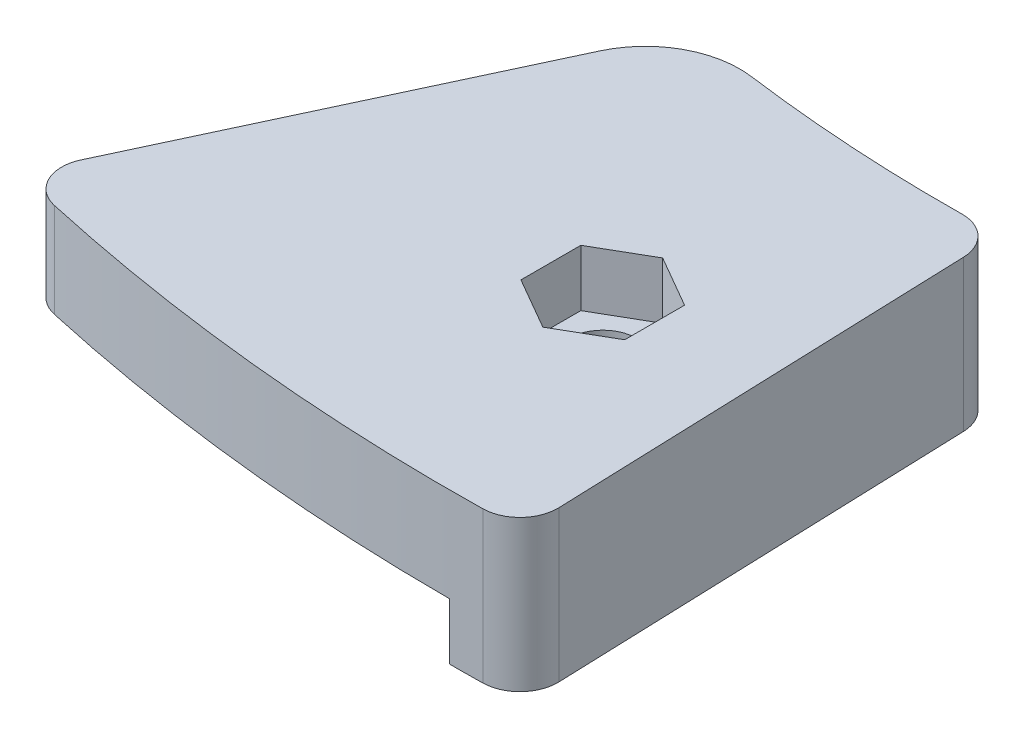
ISO-10303-21;
HEADER;
FILE_DESCRIPTION(('STEP AP214'),'2;1');
FILE_NAME('part.step','',(''),(''),'','','');
FILE_SCHEMA(('AUTOMOTIVE_DESIGN { 1 0 10303 214 1 1 1 1 }'));
ENDSEC;
DATA;
#1=APPLICATION_CONTEXT('core data for automotive mechanical design processes');
#2=APPLICATION_PROTOCOL_DEFINITION('international standard','automotive_design',2000,#1);
#3=PRODUCT_CONTEXT('',#1,'mechanical');
#4=PRODUCT('Part','Part','',(#3));
#5=PRODUCT_RELATED_PRODUCT_CATEGORY('part','',(#4));
#6=PRODUCT_DEFINITION_FORMATION('','',#4);
#7=PRODUCT_DEFINITION_CONTEXT('part definition',#1,'design');
#8=PRODUCT_DEFINITION('design','',#6,#7);
#9=PRODUCT_DEFINITION_SHAPE('','',#8);
#10=(LENGTH_UNIT() NAMED_UNIT(*) SI_UNIT(.MILLI.,.METRE.));
#11=(NAMED_UNIT(*) PLANE_ANGLE_UNIT() SI_UNIT($,.RADIAN.));
#12=(NAMED_UNIT(*) SI_UNIT($,.STERADIAN.) SOLID_ANGLE_UNIT());
#13=UNCERTAINTY_MEASURE_WITH_UNIT(LENGTH_MEASURE(1.E-05),#10,'distance_accuracy_value','');
#14=(GEOMETRIC_REPRESENTATION_CONTEXT(3) GLOBAL_UNCERTAINTY_ASSIGNED_CONTEXT((#13)) GLOBAL_UNIT_ASSIGNED_CONTEXT((#10,
#11,#12)) REPRESENTATION_CONTEXT('',''));
#15=CARTESIAN_POINT('',(0.,0.,0.));
#16=DIRECTION('',(0.,0.,1.));
#17=DIRECTION('',(1.,0.,0.));
#18=AXIS2_PLACEMENT_3D('',#15,#16,#17);
#19=CARTESIAN_POINT('',(-5.,0.,95.38));
#20=DIRECTION('',(0.,1.,0.));
#21=DIRECTION('',(0.,0.,1.));
#22=AXIS2_PLACEMENT_3D('',#19,#20,#21);
#23=CYLINDRICAL_SURFACE('',#22,1.8);
#24=CARTESIAN_POINT('',(-5.,0.,95.38));
#25=DIRECTION('',(0.,1.,0.));
#26=DIRECTION('',(0.,0.,1.));
#27=AXIS2_PLACEMENT_3D('',#24,#25,#26);
#28=CIRCLE('',#27,1.8);
#29=CARTESIAN_POINT('',(-5.,0.,97.18));
#30=VERTEX_POINT('',#29);
#31=EDGE_CURVE('E234',#30,#30,#28,.T.);
#32=ORIENTED_EDGE('',*,*,#31,.F.);
#33=EDGE_LOOP('',(#32));
#34=FACE_BOUND('',#33,.T.);
#35=CARTESIAN_POINT('',(-5.,2.,95.38));
#36=DIRECTION('',(0.,1.,0.));
#37=DIRECTION('',(0.,0.,1.));
#38=AXIS2_PLACEMENT_3D('',#35,#36,#37);
#39=CIRCLE('',#38,1.8);
#40=CARTESIAN_POINT('',(-5.,2.,97.18));
#41=VERTEX_POINT('',#40);
#42=EDGE_CURVE('E212',#41,#41,#39,.F.);
#43=ORIENTED_EDGE('',*,*,#42,.F.);
#44=EDGE_LOOP('',(#43));
#45=FACE_BOUND('',#44,.T.);
#46=ADVANCED_FACE('F41',(#34,#45),#23,.F.);
#47=CARTESIAN_POINT('',(0.,5.,0.));
#48=DIRECTION('',(0.,-1.,0.));
#49=DIRECTION('',(0.,0.,-1.));
#50=AXIS2_PLACEMENT_3D('',#47,#48,#49);
#51=CYLINDRICAL_SURFACE('',#50,82.26);
#52=CARTESIAN_POINT('',(0.,5.,0.));
#53=DIRECTION('',(0.,-1.,0.));
#54=DIRECTION('',(0.,0.,1.));
#55=AXIS2_PLACEMENT_3D('',#52,#53,#54);
#56=CIRCLE('',#55,82.26);
#57=CARTESIAN_POINT('',(0.918685308190236,5.,82.2548698698412));
#58=VERTEX_POINT('',#57);
#59=CARTESIAN_POINT('',(-10.973391310481,5.,81.5247955112251));
#60=VERTEX_POINT('',#59);
#61=EDGE_CURVE('E238',#58,#60,#56,.T.);
#62=ORIENTED_EDGE('',*,*,#61,.F.);
#63=DIRECTION('',(0.,-1.,0.));
#64=VECTOR('',#63,1.);
#65=CARTESIAN_POINT('',(0.918685308190236,5.,82.2548698698412));
#66=LINE('',#65,#64);
#67=CARTESIAN_POINT('',(0.918685308190236,0.,82.2548698698412));
#68=VERTEX_POINT('',#67);
#69=EDGE_CURVE('E287',#58,#68,#66,.T.);
#70=ORIENTED_EDGE('',*,*,#69,.T.);
#71=CARTESIAN_POINT('',(0.,0.,0.));
#72=DIRECTION('',(0.,-1.,0.));
#73=DIRECTION('',(0.,0.,1.));
#74=AXIS2_PLACEMENT_3D('',#71,#72,#73);
#75=CIRCLE('',#74,82.26);
#76=CARTESIAN_POINT('',(-10.973391310481,0.,81.5247955112251));
#77=VERTEX_POINT('',#76);
#78=EDGE_CURVE('E240',#68,#77,#75,.T.);
#79=ORIENTED_EDGE('',*,*,#78,.T.);
#80=DIRECTION('',(0.,-1.,0.));
#81=VECTOR('',#80,1.);
#82=CARTESIAN_POINT('',(-10.973391310481,5.,81.5247955112251));
#83=LINE('',#82,#81);
#84=EDGE_CURVE('E264',#77,#60,#83,.F.);
#85=ORIENTED_EDGE('',*,*,#84,.T.);
#86=EDGE_LOOP('',(#62,#70,#79,#85));
#87=FACE_BOUND('',#86,.T.);
#88=ADVANCED_FACE('F343',(#87),#51,.F.);
#89=CARTESIAN_POINT('',(-14.5819211322851,5.,80.9572428884026));
#90=DIRECTION('',(0.90630778703665,0.,0.4226182617407));
#91=DIRECTION('',(0.4226182617407,0.,-0.90630778703665));
#92=AXIS2_PLACEMENT_3D('',#89,#90,#91);
#93=PLANE('',#92);
#94=DIRECTION('',(-0.4226182617407,0.,0.90630778703665));
#95=VECTOR('',#94,1.);
#96=CARTESIAN_POINT('',(-14.5819211322851,0.,80.9572428884026));
#97=LINE('',#96,#95);
#98=CARTESIAN_POINT('',(-16.171924611728,0.,84.3670163537023));
#99=VERTEX_POINT('',#98);
#100=CARTESIAN_POINT('',(-24.9159468699549,0.,103.118632599559));
#101=VERTEX_POINT('',#100);
#102=EDGE_CURVE('E249',#99,#101,#97,.T.);
#103=ORIENTED_EDGE('',*,*,#102,.T.);
#104=DIRECTION('',(0.,-1.,0.));
#105=VECTOR('',#104,1.);
#106=CARTESIAN_POINT('',(-24.9159468699549,5.,103.118632599559));
#107=LINE('',#106,#105);
#108=CARTESIAN_POINT('',(-24.9159468699549,5.,103.118632599559));
#109=VERTEX_POINT('',#108);
#110=EDGE_CURVE('E298',#101,#109,#107,.F.);
#111=ORIENTED_EDGE('',*,*,#110,.T.);
#112=DIRECTION('',(-0.4226182617407,0.,0.90630778703665));
#113=VECTOR('',#112,1.);
#114=CARTESIAN_POINT('',(-14.5819211322851,5.,80.9572428884026));
#115=LINE('',#114,#113);
#116=CARTESIAN_POINT('',(-16.171924611728,5.,84.3670163537023));
#117=VERTEX_POINT('',#116);
#118=EDGE_CURVE('E239',#117,#109,#115,.T.);
#119=ORIENTED_EDGE('',*,*,#118,.F.);
#120=DIRECTION('',(0.,-1.,0.));
#121=VECTOR('',#120,1.);
#122=CARTESIAN_POINT('',(-16.171924611728,5.,84.3670163537023));
#123=LINE('',#122,#121);
#124=EDGE_CURVE('E250',#117,#99,#123,.T.);
#125=ORIENTED_EDGE('',*,*,#124,.T.);
#126=EDGE_LOOP('',(#103,#111,#119,#125));
#127=FACE_BOUND('',#126,.T.);
#128=ADVANCED_FACE('F336',(#127),#93,.F.);
#129=CARTESIAN_POINT('',(0.,5.,0.));
#130=DIRECTION('',(0.,-1.,0.));
#131=DIRECTION('',(0.,0.,-1.));
#132=AXIS2_PLACEMENT_3D('',#129,#130,#131);
#133=CYLINDRICAL_SURFACE('',#132,108.5);
#134=CARTESIAN_POINT('',(0.,-3.,0.));
#135=DIRECTION('',(0.,1.,0.));
#136=DIRECTION('',(0.,0.,1.));
#137=AXIS2_PLACEMENT_3D('',#134,#135,#136);
#138=CIRCLE('',#137,108.5);
#139=CARTESIAN_POINT('',(0.,-3.,108.5));
#140=VERTEX_POINT('',#139);
#141=CARTESIAN_POINT('',(1.74961017619955,-3.,108.4858924664));
#142=VERTEX_POINT('',#141);
#143=EDGE_CURVE('E225',#140,#142,#138,.T.);
#144=ORIENTED_EDGE('',*,*,#143,.T.);
#145=DIRECTION('',(0.,-1.,0.));
#146=VECTOR('',#145,1.);
#147=CARTESIAN_POINT('',(1.74961017619955,5.,108.4858924664));
#148=LINE('',#147,#146);
#149=CARTESIAN_POINT('',(1.74961017619955,5.,108.4858924664));
#150=VERTEX_POINT('',#149);
#151=EDGE_CURVE('E292',#142,#150,#148,.F.);
#152=ORIENTED_EDGE('',*,*,#151,.T.);
#153=CARTESIAN_POINT('',(0.,5.,0.));
#154=DIRECTION('',(0.,1.,0.));
#155=DIRECTION('',(0.,0.,1.));
#156=AXIS2_PLACEMENT_3D('',#153,#154,#155);
#157=CIRCLE('',#156,108.5);
#158=CARTESIAN_POINT('',(-23.53719667233,5.,105.916242252112));
#159=VERTEX_POINT('',#158);
#160=EDGE_CURVE('E242',#159,#150,#157,.T.);
#161=ORIENTED_EDGE('',*,*,#160,.F.);
#162=DIRECTION('',(0.,-1.,0.));
#163=VECTOR('',#162,1.);
#164=CARTESIAN_POINT('',(-23.53719667233,5.,105.916242252112));
#165=LINE('',#164,#163);
#166=CARTESIAN_POINT('',(-23.53719667233,0.,105.916242252112));
#167=VERTEX_POINT('',#166);
#168=EDGE_CURVE('E289',#159,#167,#165,.T.);
#169=ORIENTED_EDGE('',*,*,#168,.T.);
#170=CARTESIAN_POINT('',(0.,0.,0.));
#171=DIRECTION('',(0.,1.,0.));
#172=DIRECTION('',(0.,0.,1.));
#173=AXIS2_PLACEMENT_3D('',#170,#171,#172);
#174=CIRCLE('',#173,108.5);
#175=CARTESIAN_POINT('',(0.,0.,108.5));
#176=VERTEX_POINT('',#175);
#177=EDGE_CURVE('E255',#167,#176,#174,.T.);
#178=ORIENTED_EDGE('',*,*,#177,.T.);
#179=DIRECTION('',(0.,1.,0.));
#180=VECTOR('',#179,1.);
#181=CARTESIAN_POINT('',(0.,-3.,108.5));
#182=LINE('',#181,#180);
#183=EDGE_CURVE('E230',#140,#176,#182,.T.);
#184=ORIENTED_EDGE('',*,*,#183,.F.);
#185=EDGE_LOOP('',(#144,#152,#161,#169,#178,#184));
#186=FACE_BOUND('',#185,.T.);
#187=ADVANCED_FACE('F332',(#186),#133,.T.);
#188=CARTESIAN_POINT('',(0.,5.,0.));
#189=DIRECTION('',(0.,1.,0.));
#190=DIRECTION('',(0.,0.,1.));
#191=AXIS2_PLACEMENT_3D('',#188,#189,#190);
#192=PLANE('',#191);
#193=DIRECTION('',(-0.86602540378444,0.,0.499999999999998));
#194=VECTOR('',#193,1.);
#195=CARTESIAN_POINT('',(-5.,5.,92.2045735194571));
#196=LINE('',#195,#194);
#197=CARTESIAN_POINT('',(-5.,5.,92.2045735194571));
#198=VERTEX_POINT('',#197);
#199=CARTESIAN_POINT('',(-7.75,5.,93.7922867597285));
#200=VERTEX_POINT('',#199);
#201=EDGE_CURVE('E168',#198,#200,#196,.T.);
#202=ORIENTED_EDGE('',*,*,#201,.F.);
#203=DIRECTION('',(-0.86602540378444,0.,-0.499999999999998));
#204=VECTOR('',#203,1.);
#205=CARTESIAN_POINT('',(-2.25,5.,93.7922867597285));
#206=LINE('',#205,#204);
#207=CARTESIAN_POINT('',(-2.25,5.,93.7922867597285));
#208=VERTEX_POINT('',#207);
#209=EDGE_CURVE('E184',#208,#198,#206,.T.);
#210=ORIENTED_EDGE('',*,*,#209,.F.);
#211=DIRECTION('',(0.,0.,-1.));
#212=VECTOR('',#211,1.);
#213=CARTESIAN_POINT('',(-2.25,5.,96.9677132402715));
#214=LINE('',#213,#212);
#215=CARTESIAN_POINT('',(-2.25,5.,96.9677132402715));
#216=VERTEX_POINT('',#215);
#217=EDGE_CURVE('E189',#216,#208,#214,.T.);
#218=ORIENTED_EDGE('',*,*,#217,.F.);
#219=DIRECTION('',(0.86602540378444,0.,-0.499999999999998));
#220=VECTOR('',#219,1.);
#221=CARTESIAN_POINT('',(-5.,5.,98.5554264805429));
#222=LINE('',#221,#220);
#223=CARTESIAN_POINT('',(-5.,5.,98.5554264805429));
#224=VERTEX_POINT('',#223);
#225=EDGE_CURVE('E204',#224,#216,#222,.T.);
#226=ORIENTED_EDGE('',*,*,#225,.F.);
#227=DIRECTION('',(0.86602540378444,0.,0.499999999999998));
#228=VECTOR('',#227,1.);
#229=CARTESIAN_POINT('',(-7.75,5.,96.9677132402715));
#230=LINE('',#229,#228);
#231=CARTESIAN_POINT('',(-7.75,5.,96.9677132402715));
#232=VERTEX_POINT('',#231);
#233=EDGE_CURVE('E202',#232,#224,#230,.T.);
#234=ORIENTED_EDGE('',*,*,#233,.F.);
#235=DIRECTION('',(0.,0.,1.));
#236=VECTOR('',#235,1.);
#237=CARTESIAN_POINT('',(-7.75,5.,93.7922867597285));
#238=LINE('',#237,#236);
#239=EDGE_CURVE('E200',#200,#232,#238,.T.);
#240=ORIENTED_EDGE('',*,*,#239,.F.);
#241=EDGE_LOOP('',(#202,#210,#218,#226,#234,#240));
#242=FACE_BOUND('',#241,.T.);
#243=DIRECTION('',(0.034899496702502,0.,0.999390827019096));
#244=VECTOR('',#243,1.);
#245=CARTESIAN_POINT('',(0.,5.,0.));
#246=LINE('',#245,#244);
#247=CARTESIAN_POINT('',(2.93980309906748,5.,84.1849461467947));
#248=VERTEX_POINT('',#247);
#249=CARTESIAN_POINT('',(3.71614095141378,5.,106.416353519697));
#250=VERTEX_POINT('',#249);
#251=EDGE_CURVE('E223',#248,#250,#246,.T.);
#252=ORIENTED_EDGE('',*,*,#251,.F.);
#253=CARTESIAN_POINT('',(0.941021445029289,5.,84.2547451401996));
#254=DIRECTION('',(0.,1.,0.));
#255=DIRECTION('',(0.,0.,1.));
#256=AXIS2_PLACEMENT_3D('',#253,#254,#255);
#257=CIRCLE('',#256,2.);
#258=EDGE_CURVE('E285',#248,#58,#257,.T.);
#259=ORIENTED_EDGE('',*,*,#258,.T.);
#260=ORIENTED_EDGE('',*,*,#61,.T.);
#261=CARTESIAN_POINT('',(-11.6403856765448,5.,86.4801076624058));
#262=DIRECTION('',(0.,1.,0.));
#263=DIRECTION('',(0.,0.,1.));
#264=AXIS2_PLACEMENT_3D('',#261,#262,#263);
#265=CIRCLE('',#264,5.);
#266=EDGE_CURVE('E261',#60,#117,#265,.T.);
#267=ORIENTED_EDGE('',*,*,#266,.T.);
#268=ORIENTED_EDGE('',*,*,#118,.T.);
#269=CARTESIAN_POINT('',(-23.1033312958816,5.,103.963869123041));
#270=DIRECTION('',(0.,1.,0.));
#271=DIRECTION('',(0.,0.,1.));
#272=AXIS2_PLACEMENT_3D('',#269,#270,#271);
#273=CIRCLE('',#272,2.);
#274=EDGE_CURVE('E278',#109,#159,#273,.T.);
#275=ORIENTED_EDGE('',*,*,#274,.T.);
#276=ORIENTED_EDGE('',*,*,#160,.T.);
#277=CARTESIAN_POINT('',(1.71735929737559,5.,106.486152513102));
#278=DIRECTION('',(0.,1.,0.));
#279=DIRECTION('',(0.,0.,1.));
#280=AXIS2_PLACEMENT_3D('',#277,#278,#279);
#281=CIRCLE('',#280,2.);
#282=EDGE_CURVE('E284',#150,#250,#281,.T.);
#283=ORIENTED_EDGE('',*,*,#282,.T.);
#284=EDGE_LOOP('',(#252,#259,#260,#267,#268,#275,#276,#283));
#285=FACE_BOUND('',#284,.T.);
#286=ADVANCED_FACE('F324',(#242,#285),#192,.T.);
#287=CARTESIAN_POINT('',(0.,0.,0.));
#288=DIRECTION('',(0.,1.,0.));
#289=DIRECTION('',(0.,0.,1.));
#290=AXIS2_PLACEMENT_3D('',#287,#288,#289);
#291=PLANE('',#290);
#292=ORIENTED_EDGE('',*,*,#31,.T.);
#293=EDGE_LOOP('',(#292));
#294=FACE_BOUND('',#293,.T.);
#295=ORIENTED_EDGE('',*,*,#177,.F.);
#296=CARTESIAN_POINT('',(-23.1033312958816,0.,103.963869123041));
#297=DIRECTION('',(0.,1.,0.));
#298=DIRECTION('',(0.,0.,1.));
#299=AXIS2_PLACEMENT_3D('',#296,#297,#298);
#300=CIRCLE('',#299,2.);
#301=EDGE_CURVE('E65',#167,#101,#300,.F.);
#302=ORIENTED_EDGE('',*,*,#301,.T.);
#303=ORIENTED_EDGE('',*,*,#102,.F.);
#304=CARTESIAN_POINT('',(-11.6403856765448,0.,86.4801076624058));
#305=DIRECTION('',(0.,1.,0.));
#306=DIRECTION('',(0.,0.,1.));
#307=AXIS2_PLACEMENT_3D('',#304,#305,#306);
#308=CIRCLE('',#307,5.);
#309=EDGE_CURVE('E258',#99,#77,#308,.F.);
#310=ORIENTED_EDGE('',*,*,#309,.T.);
#311=ORIENTED_EDGE('',*,*,#78,.F.);
#312=CARTESIAN_POINT('',(0.941021445029289,0.,84.2547451401996));
#313=DIRECTION('',(0.,1.,0.));
#314=DIRECTION('',(0.,0.,1.));
#315=AXIS2_PLACEMENT_3D('',#312,#313,#314);
#316=CIRCLE('',#315,2.);
#317=CARTESIAN_POINT('',(1.43685175027423,0.,82.317181642298));
#318=VERTEX_POINT('',#317);
#319=EDGE_CURVE('E11',#68,#318,#316,.F.);
#320=ORIENTED_EDGE('',*,*,#319,.T.);
#321=CARTESIAN_POINT('',(2.,0.,84.236260600765));
#322=DIRECTION('',(0.,1.,0.));
#323=DIRECTION('',(0.,0.,1.));
#324=AXIS2_PLACEMENT_3D('',#321,#322,#323);
#325=CIRCLE('',#324,2.);
#326=CARTESIAN_POINT('',(0.,0.,84.236260600765));
#327=VERTEX_POINT('',#326);
#328=EDGE_CURVE('E49',#318,#327,#325,.T.);
#329=ORIENTED_EDGE('',*,*,#328,.T.);
#330=DIRECTION('',(0.,0.,-1.));
#331=VECTOR('',#330,1.);
#332=CARTESIAN_POINT('',(0.,0.,82.26));
#333=LINE('',#332,#331);
#334=EDGE_CURVE('E241',#176,#327,#333,.T.);
#335=ORIENTED_EDGE('',*,*,#334,.F.);
#336=EDGE_LOOP('',(#295,#302,#303,#310,#311,#320,#329,#335));
#337=FACE_BOUND('',#336,.T.);
#338=ADVANCED_FACE('F297',(#294,#337),#291,.F.);
#339=CARTESIAN_POINT('',(0.,-3.,0.));
#340=DIRECTION('',(1.,0.,0.));
#341=DIRECTION('',(0.,0.,-1.));
#342=AXIS2_PLACEMENT_3D('',#339,#340,#341);
#343=PLANE('',#342);
#344=ORIENTED_EDGE('',*,*,#334,.T.);
#345=DIRECTION('',(0.,-1.,0.));
#346=VECTOR('',#345,1.);
#347=CARTESIAN_POINT('',(0.,-3.,84.236260600765));
#348=LINE('',#347,#346);
#349=CARTESIAN_POINT('',(0.,-3.,84.236260600765));
#350=VERTEX_POINT('',#349);
#351=EDGE_CURVE('E270',#327,#350,#348,.T.);
#352=ORIENTED_EDGE('',*,*,#351,.T.);
#353=DIRECTION('',(0.,0.,-1.));
#354=VECTOR('',#353,1.);
#355=CARTESIAN_POINT('',(0.,-3.,0.));
#356=LINE('',#355,#354);
#357=EDGE_CURVE('E220',#140,#350,#356,.T.);
#358=ORIENTED_EDGE('',*,*,#357,.F.);
#359=ORIENTED_EDGE('',*,*,#183,.T.);
#360=EDGE_LOOP('',(#344,#352,#358,#359));
#361=FACE_BOUND('',#360,.T.);
#362=ADVANCED_FACE('F304',(#361),#343,.F.);
#363=CARTESIAN_POINT('',(0.,-3.,0.));
#364=DIRECTION('',(-0.999390827019096,0.,0.034899496702502));
#365=DIRECTION('',(0.034899496702502,0.,0.999390827019096));
#366=AXIS2_PLACEMENT_3D('',#363,#364,#365);
#367=PLANE('',#366);
#368=DIRECTION('',(0.034899496702502,0.,0.999390827019096));
#369=VECTOR('',#368,1.);
#370=CARTESIAN_POINT('',(0.,-3.,0.));
#371=LINE('',#370,#369);
#372=CARTESIAN_POINT('',(2.93980309906748,-3.,84.1849461467947));
#373=VERTEX_POINT('',#372);
#374=CARTESIAN_POINT('',(3.71614095141378,-3.,106.416353519697));
#375=VERTEX_POINT('',#374);
#376=EDGE_CURVE('E228',#373,#375,#371,.T.);
#377=ORIENTED_EDGE('',*,*,#376,.F.);
#378=DIRECTION('',(0.,-1.,0.));
#379=VECTOR('',#378,1.);
#380=CARTESIAN_POINT('',(2.93980309906748,-3.,84.1849461467946));
#381=LINE('',#380,#379);
#382=EDGE_CURVE('E279',#373,#248,#381,.F.);
#383=ORIENTED_EDGE('',*,*,#382,.T.);
#384=ORIENTED_EDGE('',*,*,#251,.T.);
#385=DIRECTION('',(0.,-1.,0.));
#386=VECTOR('',#385,1.);
#387=CARTESIAN_POINT('',(3.71614095141378,-3.,106.416353519697));
#388=LINE('',#387,#386);
#389=EDGE_CURVE('E277',#250,#375,#388,.T.);
#390=ORIENTED_EDGE('',*,*,#389,.T.);
#391=EDGE_LOOP('',(#377,#383,#384,#390));
#392=FACE_BOUND('',#391,.T.);
#393=ADVANCED_FACE('F318',(#392),#367,.F.);
#394=CARTESIAN_POINT('',(0.,-3.,0.));
#395=DIRECTION('',(0.,1.,0.));
#396=DIRECTION('',(0.,0.,1.));
#397=AXIS2_PLACEMENT_3D('',#394,#395,#396);
#398=PLANE('',#397);
#399=ORIENTED_EDGE('',*,*,#357,.T.);
#400=CARTESIAN_POINT('',(2.,-3.,84.236260600765));
#401=DIRECTION('',(0.,1.,0.));
#402=DIRECTION('',(0.,0.,1.));
#403=AXIS2_PLACEMENT_3D('',#400,#401,#402);
#404=CIRCLE('',#403,2.);
#405=CARTESIAN_POINT('',(1.43685175027422,-3.,82.317181642298));
#406=VERTEX_POINT('',#405);
#407=EDGE_CURVE('E274',#350,#406,#404,.F.);
#408=ORIENTED_EDGE('',*,*,#407,.T.);
#409=CARTESIAN_POINT('',(0.941021445029289,-3.,84.2547451401996));
#410=DIRECTION('',(0.,1.,0.));
#411=DIRECTION('',(0.,0.,1.));
#412=AXIS2_PLACEMENT_3D('',#409,#410,#411);
#413=CIRCLE('',#412,2.);
#414=EDGE_CURVE('E275',#406,#373,#413,.F.);
#415=ORIENTED_EDGE('',*,*,#414,.T.);
#416=ORIENTED_EDGE('',*,*,#376,.T.);
#417=CARTESIAN_POINT('',(1.71735929737559,-3.,106.486152513102));
#418=DIRECTION('',(0.,1.,0.));
#419=DIRECTION('',(0.,0.,1.));
#420=AXIS2_PLACEMENT_3D('',#417,#418,#419);
#421=CIRCLE('',#420,2.);
#422=EDGE_CURVE('E266',#375,#142,#421,.F.);
#423=ORIENTED_EDGE('',*,*,#422,.T.);
#424=ORIENTED_EDGE('',*,*,#143,.F.);
#425=EDGE_LOOP('',(#399,#408,#415,#416,#423,#424));
#426=FACE_BOUND('',#425,.T.);
#427=ADVANCED_FACE('F309',(#426),#398,.F.);
#428=CARTESIAN_POINT('',(0.,2.,0.));
#429=DIRECTION('',(0.,1.,0.));
#430=DIRECTION('',(0.,0.,1.));
#431=AXIS2_PLACEMENT_3D('',#428,#429,#430);
#432=PLANE('',#431);
#433=DIRECTION('',(-0.86602540378444,0.,0.499999999999998));
#434=VECTOR('',#433,1.);
#435=CARTESIAN_POINT('',(-5.,2.,92.2045735194571));
#436=LINE('',#435,#434);
#437=CARTESIAN_POINT('',(-5.,2.,92.2045735194571));
#438=VERTEX_POINT('',#437);
#439=CARTESIAN_POINT('',(-7.75,2.,93.7922867597285));
#440=VERTEX_POINT('',#439);
#441=EDGE_CURVE('E161',#438,#440,#436,.T.);
#442=ORIENTED_EDGE('',*,*,#441,.T.);
#443=DIRECTION('',(0.,0.,1.));
#444=VECTOR('',#443,1.);
#445=CARTESIAN_POINT('',(-7.75,2.,93.7922867597285));
#446=LINE('',#445,#444);
#447=CARTESIAN_POINT('',(-7.75,2.,96.9677132402715));
#448=VERTEX_POINT('',#447);
#449=EDGE_CURVE('E172',#440,#448,#446,.T.);
#450=ORIENTED_EDGE('',*,*,#449,.T.);
#451=DIRECTION('',(0.86602540378444,0.,0.499999999999998));
#452=VECTOR('',#451,1.);
#453=CARTESIAN_POINT('',(-7.75,2.,96.9677132402715));
#454=LINE('',#453,#452);
#455=CARTESIAN_POINT('',(-5.,2.,98.5554264805429));
#456=VERTEX_POINT('',#455);
#457=EDGE_CURVE('E177',#448,#456,#454,.T.);
#458=ORIENTED_EDGE('',*,*,#457,.T.);
#459=DIRECTION('',(0.86602540378444,0.,-0.499999999999998));
#460=VECTOR('',#459,1.);
#461=CARTESIAN_POINT('',(-5.,2.,98.5554264805429));
#462=LINE('',#461,#460);
#463=CARTESIAN_POINT('',(-2.25,2.,96.9677132402715));
#464=VERTEX_POINT('',#463);
#465=EDGE_CURVE('E195',#456,#464,#462,.T.);
#466=ORIENTED_EDGE('',*,*,#465,.T.);
#467=DIRECTION('',(0.,0.,-1.));
#468=VECTOR('',#467,1.);
#469=CARTESIAN_POINT('',(-2.25,2.,96.9677132402715));
#470=LINE('',#469,#468);
#471=CARTESIAN_POINT('',(-2.25,2.,93.7922867597285));
#472=VERTEX_POINT('',#471);
#473=EDGE_CURVE('E193',#464,#472,#470,.T.);
#474=ORIENTED_EDGE('',*,*,#473,.T.);
#475=DIRECTION('',(-0.86602540378444,0.,-0.499999999999998));
#476=VECTOR('',#475,1.);
#477=CARTESIAN_POINT('',(-2.25,2.,93.7922867597285));
#478=LINE('',#477,#476);
#479=EDGE_CURVE('E171',#472,#438,#478,.T.);
#480=ORIENTED_EDGE('',*,*,#479,.T.);
#481=EDGE_LOOP('',(#442,#450,#458,#466,#474,#480));
#482=FACE_BOUND('',#481,.T.);
#483=ORIENTED_EDGE('',*,*,#42,.T.);
#484=EDGE_LOOP('',(#483));
#485=FACE_BOUND('',#484,.T.);
#486=ADVANCED_FACE('F181',(#482,#485),#432,.T.);
#487=CARTESIAN_POINT('',(-5.,2.,92.2045735194571));
#488=DIRECTION('',(-0.499999999999998,0.,-0.86602540378444));
#489=DIRECTION('',(-0.86602540378444,0.,0.499999999999998));
#490=AXIS2_PLACEMENT_3D('',#487,#488,#489);
#491=PLANE('',#490);
#492=ORIENTED_EDGE('',*,*,#201,.T.);
#493=DIRECTION('',(0.,1.,0.));
#494=VECTOR('',#493,1.);
#495=CARTESIAN_POINT('',(-7.75,2.,93.7922867597285));
#496=LINE('',#495,#494);
#497=EDGE_CURVE('E159',#440,#200,#496,.T.);
#498=ORIENTED_EDGE('',*,*,#497,.F.);
#499=ORIENTED_EDGE('',*,*,#441,.F.);
#500=DIRECTION('',(0.,1.,0.));
#501=VECTOR('',#500,1.);
#502=CARTESIAN_POINT('',(-5.,2.,92.2045735194571));
#503=LINE('',#502,#501);
#504=EDGE_CURVE('E209',#438,#198,#503,.T.);
#505=ORIENTED_EDGE('',*,*,#504,.T.);
#506=EDGE_LOOP('',(#492,#498,#499,#505));
#507=FACE_BOUND('',#506,.T.);
#508=ADVANCED_FACE('F163',(#507),#491,.F.);
#509=CARTESIAN_POINT('',(-2.25,2.,93.7922867597285));
#510=DIRECTION('',(0.499999999999998,0.,-0.86602540378444));
#511=DIRECTION('',(-0.86602540378444,0.,-0.499999999999998));
#512=AXIS2_PLACEMENT_3D('',#509,#510,#511);
#513=PLANE('',#512);
#514=ORIENTED_EDGE('',*,*,#209,.T.);
#515=ORIENTED_EDGE('',*,*,#504,.F.);
#516=ORIENTED_EDGE('',*,*,#479,.F.);
#517=DIRECTION('',(0.,1.,0.));
#518=VECTOR('',#517,1.);
#519=CARTESIAN_POINT('',(-2.25,2.,93.7922867597285));
#520=LINE('',#519,#518);
#521=EDGE_CURVE('E215',#472,#208,#520,.T.);
#522=ORIENTED_EDGE('',*,*,#521,.T.);
#523=EDGE_LOOP('',(#514,#515,#516,#522));
#524=FACE_BOUND('',#523,.T.);
#525=ADVANCED_FACE('F427',(#524),#513,.F.);
#526=CARTESIAN_POINT('',(-2.25,2.,96.9677132402715));
#527=DIRECTION('',(1.,0.,0.));
#528=DIRECTION('',(0.,0.,-1.));
#529=AXIS2_PLACEMENT_3D('',#526,#527,#528);
#530=PLANE('',#529);
#531=ORIENTED_EDGE('',*,*,#217,.T.);
#532=ORIENTED_EDGE('',*,*,#521,.F.);
#533=ORIENTED_EDGE('',*,*,#473,.F.);
#534=DIRECTION('',(0.,1.,0.));
#535=VECTOR('',#534,1.);
#536=CARTESIAN_POINT('',(-2.25,2.,96.9677132402715));
#537=LINE('',#536,#535);
#538=EDGE_CURVE('E211',#464,#216,#537,.T.);
#539=ORIENTED_EDGE('',*,*,#538,.T.);
#540=EDGE_LOOP('',(#531,#532,#533,#539));
#541=FACE_BOUND('',#540,.T.);
#542=ADVANCED_FACE('F416',(#541),#530,.F.);
#543=CARTESIAN_POINT('',(-5.,2.,98.5554264805429));
#544=DIRECTION('',(0.499999999999998,0.,0.86602540378444));
#545=DIRECTION('',(0.86602540378444,0.,-0.499999999999998));
#546=AXIS2_PLACEMENT_3D('',#543,#544,#545);
#547=PLANE('',#546);
#548=ORIENTED_EDGE('',*,*,#225,.T.);
#549=ORIENTED_EDGE('',*,*,#538,.F.);
#550=ORIENTED_EDGE('',*,*,#465,.F.);
#551=DIRECTION('',(0.,1.,0.));
#552=VECTOR('',#551,1.);
#553=CARTESIAN_POINT('',(-5.,2.,98.5554264805429));
#554=LINE('',#553,#552);
#555=EDGE_CURVE('E218',#456,#224,#554,.T.);
#556=ORIENTED_EDGE('',*,*,#555,.T.);
#557=EDGE_LOOP('',(#548,#549,#550,#556));
#558=FACE_BOUND('',#557,.T.);
#559=ADVANCED_FACE('F408',(#558),#547,.F.);
#560=CARTESIAN_POINT('',(-7.75,2.,96.9677132402715));
#561=DIRECTION('',(-0.499999999999998,0.,0.86602540378444));
#562=DIRECTION('',(0.86602540378444,0.,0.499999999999998));
#563=AXIS2_PLACEMENT_3D('',#560,#561,#562);
#564=PLANE('',#563);
#565=ORIENTED_EDGE('',*,*,#233,.T.);
#566=ORIENTED_EDGE('',*,*,#555,.F.);
#567=ORIENTED_EDGE('',*,*,#457,.F.);
#568=DIRECTION('',(0.,1.,0.));
#569=VECTOR('',#568,1.);
#570=CARTESIAN_POINT('',(-7.75,2.,96.9677132402715));
#571=LINE('',#570,#569);
#572=EDGE_CURVE('E167',#448,#232,#571,.T.);
#573=ORIENTED_EDGE('',*,*,#572,.T.);
#574=EDGE_LOOP('',(#565,#566,#567,#573));
#575=FACE_BOUND('',#574,.T.);
#576=ADVANCED_FACE('F402',(#575),#564,.F.);
#577=CARTESIAN_POINT('',(-7.75,2.,93.7922867597285));
#578=DIRECTION('',(-1.,0.,0.));
#579=DIRECTION('',(0.,0.,1.));
#580=AXIS2_PLACEMENT_3D('',#577,#578,#579);
#581=PLANE('',#580);
#582=ORIENTED_EDGE('',*,*,#239,.T.);
#583=ORIENTED_EDGE('',*,*,#572,.F.);
#584=ORIENTED_EDGE('',*,*,#449,.F.);
#585=ORIENTED_EDGE('',*,*,#497,.T.);
#586=EDGE_LOOP('',(#582,#583,#584,#585));
#587=FACE_BOUND('',#586,.T.);
#588=ADVANCED_FACE('F174',(#587),#581,.F.);
#589=CARTESIAN_POINT('',(-11.6403856765448,5.,86.4801076624058));
#590=DIRECTION('',(0.,-1.,0.));
#591=DIRECTION('',(0.,0.,-1.));
#592=AXIS2_PLACEMENT_3D('',#589,#590,#591);
#593=CYLINDRICAL_SURFACE('',#592,5.);
#594=ORIENTED_EDGE('',*,*,#266,.F.);
#595=ORIENTED_EDGE('',*,*,#84,.F.);
#596=ORIENTED_EDGE('',*,*,#309,.F.);
#597=ORIENTED_EDGE('',*,*,#124,.F.);
#598=EDGE_LOOP('',(#594,#595,#596,#597));
#599=FACE_BOUND('',#598,.T.);
#600=ADVANCED_FACE('F344',(#599),#593,.T.);
#601=CARTESIAN_POINT('',(0.941021445029289,5.,84.2547451401996));
#602=DIRECTION('',(0.,-1.,0.));
#603=DIRECTION('',(0.,0.,-1.));
#604=AXIS2_PLACEMENT_3D('',#601,#602,#603);
#605=CYLINDRICAL_SURFACE('',#604,2.);
#606=ORIENTED_EDGE('',*,*,#382,.F.);
#607=ORIENTED_EDGE('',*,*,#414,.F.);
#608=DIRECTION('',(0.,-1.,0.));
#609=VECTOR('',#608,1.);
#610=CARTESIAN_POINT('',(1.43685175027422,0.,82.317181642298));
#611=LINE('',#610,#609);
#612=EDGE_CURVE('E44',#318,#406,#611,.T.);
#613=ORIENTED_EDGE('',*,*,#612,.F.);
#614=ORIENTED_EDGE('',*,*,#319,.F.);
#615=ORIENTED_EDGE('',*,*,#69,.F.);
#616=ORIENTED_EDGE('',*,*,#258,.F.);
#617=EDGE_LOOP('',(#606,#607,#613,#614,#615,#616));
#618=FACE_BOUND('',#617,.T.);
#619=ADVANCED_FACE('F314',(#618),#605,.T.);
#620=CARTESIAN_POINT('',(2.,5.,84.236260600765));
#621=DIRECTION('',(0.,-1.,0.));
#622=DIRECTION('',(0.,0.,-1.));
#623=AXIS2_PLACEMENT_3D('',#620,#621,#622);
#624=CYLINDRICAL_SURFACE('',#623,2.);
#625=ORIENTED_EDGE('',*,*,#407,.F.);
#626=ORIENTED_EDGE('',*,*,#351,.F.);
#627=ORIENTED_EDGE('',*,*,#328,.F.);
#628=ORIENTED_EDGE('',*,*,#612,.T.);
#629=EDGE_LOOP('',(#625,#626,#627,#628));
#630=FACE_BOUND('',#629,.T.);
#631=ADVANCED_FACE('F310',(#630),#624,.T.);
#632=CARTESIAN_POINT('',(1.71735929737559,5.,106.486152513102));
#633=DIRECTION('',(0.,-1.,0.));
#634=DIRECTION('',(0.,0.,-1.));
#635=AXIS2_PLACEMENT_3D('',#632,#633,#634);
#636=CYLINDRICAL_SURFACE('',#635,2.);
#637=ORIENTED_EDGE('',*,*,#422,.F.);
#638=ORIENTED_EDGE('',*,*,#389,.F.);
#639=ORIENTED_EDGE('',*,*,#282,.F.);
#640=ORIENTED_EDGE('',*,*,#151,.F.);
#641=EDGE_LOOP('',(#637,#638,#639,#640));
#642=FACE_BOUND('',#641,.T.);
#643=ADVANCED_FACE('F330',(#642),#636,.T.);
#644=CARTESIAN_POINT('',(-23.1033312958816,5.,103.963869123041));
#645=DIRECTION('',(0.,-1.,0.));
#646=DIRECTION('',(0.,0.,-1.));
#647=AXIS2_PLACEMENT_3D('',#644,#645,#646);
#648=CYLINDRICAL_SURFACE('',#647,2.);
#649=ORIENTED_EDGE('',*,*,#274,.F.);
#650=ORIENTED_EDGE('',*,*,#110,.F.);
#651=ORIENTED_EDGE('',*,*,#301,.F.);
#652=ORIENTED_EDGE('',*,*,#168,.F.);
#653=EDGE_LOOP('',(#649,#650,#651,#652));
#654=FACE_BOUND('',#653,.T.);
#655=ADVANCED_FACE('F43',(#654),#648,.T.);
#656=CLOSED_SHELL('',(#46,#88,#128,#187,#286,#338,#362,#393,#427,#486,#508,#525,#542,#559,#576,
#588,#600,#619,#631,#643,#655));
#657=MANIFOLD_SOLID_BREP('B2',#656);
#658=ADVANCED_BREP_SHAPE_REPRESENTATION('',(#18,#657),#14);
#659=SHAPE_DEFINITION_REPRESENTATION(#9,#658);
ENDSEC;
END-ISO-10303-21;
